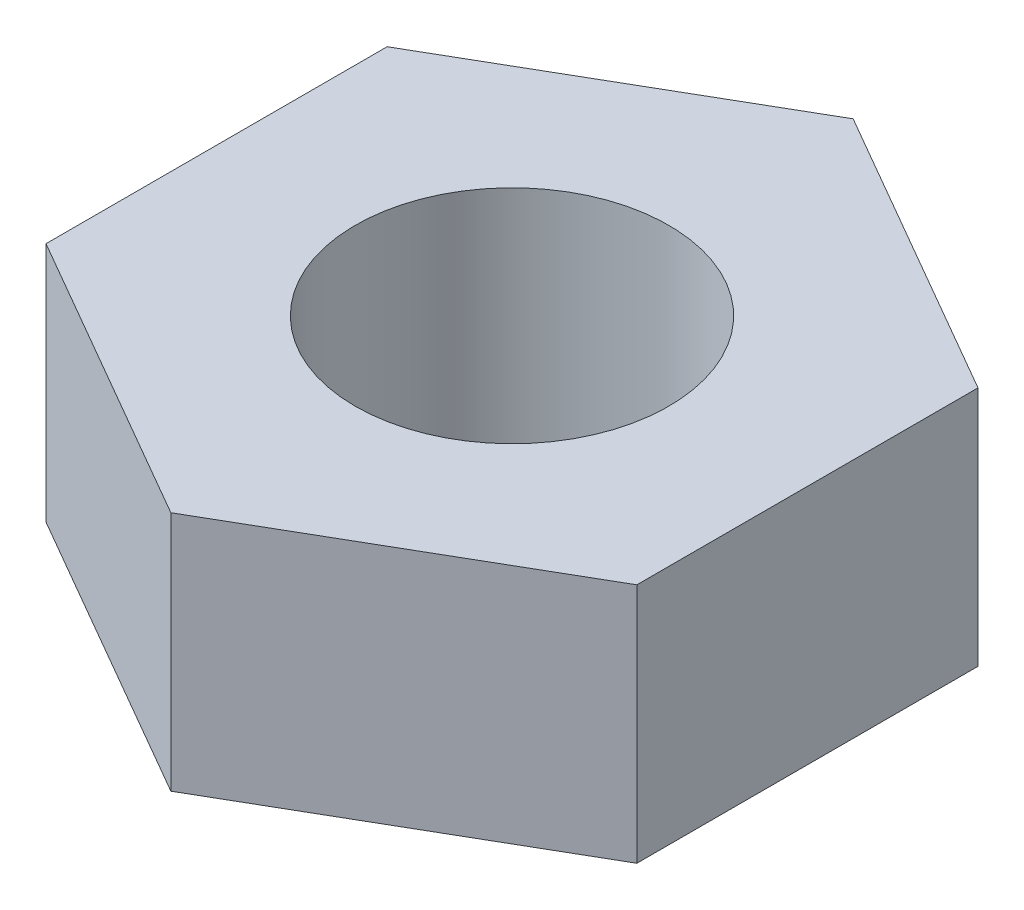
ISO-10303-21;
HEADER;
FILE_DESCRIPTION(('STEP AP214'),'2;1');
FILE_NAME('part.step','',(''),(''),'','','');
FILE_SCHEMA(('AUTOMOTIVE_DESIGN { 1 0 10303 214 1 1 1 1 }'));
ENDSEC;
DATA;
#1=APPLICATION_CONTEXT('core data for automotive mechanical design processes');
#2=APPLICATION_PROTOCOL_DEFINITION('international standard','automotive_design',2000,#1);
#3=PRODUCT_CONTEXT('',#1,'mechanical');
#4=PRODUCT('Part','Part','',(#3));
#5=PRODUCT_RELATED_PRODUCT_CATEGORY('part','',(#4));
#6=PRODUCT_DEFINITION_FORMATION('','',#4);
#7=PRODUCT_DEFINITION_CONTEXT('part definition',#1,'design');
#8=PRODUCT_DEFINITION('design','',#6,#7);
#9=PRODUCT_DEFINITION_SHAPE('','',#8);
#10=(LENGTH_UNIT() NAMED_UNIT(*) SI_UNIT(.MILLI.,.METRE.));
#11=(NAMED_UNIT(*) PLANE_ANGLE_UNIT() SI_UNIT($,.RADIAN.));
#12=(NAMED_UNIT(*) SI_UNIT($,.STERADIAN.) SOLID_ANGLE_UNIT());
#13=UNCERTAINTY_MEASURE_WITH_UNIT(LENGTH_MEASURE(1.E-05),#10,'distance_accuracy_value','');
#14=(GEOMETRIC_REPRESENTATION_CONTEXT(3) GLOBAL_UNCERTAINTY_ASSIGNED_CONTEXT((#13)) GLOBAL_UNIT_ASSIGNED_CONTEXT((#10,
#11,#12)) REPRESENTATION_CONTEXT('',''));
#15=CARTESIAN_POINT('',(0.,0.,0.));
#16=DIRECTION('',(0.,0.,1.));
#17=DIRECTION('',(1.,0.,0.));
#18=AXIS2_PLACEMENT_3D('',#15,#16,#17);
#19=CARTESIAN_POINT('',(-1.274,17.,-20.32227878526));
#20=DIRECTION('',(0.,1.,0.));
#21=DIRECTION('',(0.866025403784464,0.,-0.499999999999956));
#22=AXIS2_PLACEMENT_3D('',#19,#20,#21);
#23=PLANE('',#22);
#24=CARTESIAN_POINT('',(0.,17.,-24.));
#25=DIRECTION('',(0.,1.,0.));
#26=DIRECTION('',(0.,0.,1.));
#27=AXIS2_PLACEMENT_3D('',#24,#25,#26);
#28=CIRCLE('',#27,1.3000000000002);
#29=CARTESIAN_POINT('',(0.,17.,-22.6999999999998));
#30=VERTEX_POINT('',#29);
#31=EDGE_CURVE('E21',#30,#30,#28,.F.);
#32=ORIENTED_EDGE('',*,*,#31,.T.);
#33=EDGE_LOOP('',(#32));
#34=FACE_BOUND('',#33,.T.);
#35=DIRECTION('',(0.866025403783726,0.,0.500000000001234));
#36=VECTOR('',#35,1.);
#37=CARTESIAN_POINT('',(1.225,17.,-26.12176223927));
#38=LINE('',#37,#36);
#39=CARTESIAN_POINT('',(2.44999999987504,17.,-25.4145081595822));
#40=VERTEX_POINT('',#39);
#41=CARTESIAN_POINT('',(0.,17.,-26.8290163190298));
#42=VERTEX_POINT('',#41);
#43=EDGE_CURVE('E104',#40,#42,#38,.F.);
#44=ORIENTED_EDGE('',*,*,#43,.T.);
#45=DIRECTION('',(0.866025403783726,0.,-0.500000000001234));
#46=VECTOR('',#45,1.);
#47=CARTESIAN_POINT('',(-1.225,17.,-26.12176223927));
#48=LINE('',#47,#46);
#49=CARTESIAN_POINT('',(-2.45000000000008,17.,-25.4145081595101));
#50=VERTEX_POINT('',#49);
#51=EDGE_CURVE('E83',#42,#50,#48,.F.);
#52=ORIENTED_EDGE('',*,*,#51,.T.);
#53=DIRECTION('',(0.,0.,-1.));
#54=VECTOR('',#53,1.);
#55=CARTESIAN_POINT('',(-2.45,17.,-24.));
#56=LINE('',#55,#54);
#57=CARTESIAN_POINT('',(-2.45000000000004,17.,-22.5854918406343));
#58=VERTEX_POINT('',#57);
#59=EDGE_CURVE('E80',#50,#58,#56,.F.);
#60=ORIENTED_EDGE('',*,*,#59,.T.);
#61=DIRECTION('',(-0.866025403783727,0.,-0.500000000001233));
#62=VECTOR('',#61,1.);
#63=CARTESIAN_POINT('',(-1.225,17.,-21.87823776073));
#64=LINE('',#63,#62);
#65=CARTESIAN_POINT('',(0.,17.,-21.1709836809701));
#66=VERTEX_POINT('',#65);
#67=EDGE_CURVE('E81',#58,#66,#64,.F.);
#68=ORIENTED_EDGE('',*,*,#67,.T.);
#69=DIRECTION('',(-0.866025403783727,0.,0.500000000001233));
#70=VECTOR('',#69,1.);
#71=CARTESIAN_POINT('',(1.225,17.,-21.87823776073));
#72=LINE('',#71,#70);
#73=CARTESIAN_POINT('',(2.45000000000008,17.,-22.5854918404899));
#74=VERTEX_POINT('',#73);
#75=EDGE_CURVE('E110',#66,#74,#72,.F.);
#76=ORIENTED_EDGE('',*,*,#75,.T.);
#77=DIRECTION('',(0.,0.,1.));
#78=VECTOR('',#77,1.);
#79=CARTESIAN_POINT('',(2.45,17.,-24.));
#80=LINE('',#79,#78);
#81=EDGE_CURVE('E105',#74,#40,#80,.F.);
#82=ORIENTED_EDGE('',*,*,#81,.T.);
#83=EDGE_LOOP('',(#44,#52,#60,#68,#76,#82));
#84=FACE_BOUND('',#83,.T.);
#85=ADVANCED_FACE('F17',(#34,#84),#23,.T.);
#86=CARTESIAN_POINT('',(-0.049,14.96,-21.14269351778));
#87=DIRECTION('',(0.500000000001233,0.,0.866025403783727));
#88=DIRECTION('',(0.866025403783727,0.,-0.500000000001233));
#89=AXIS2_PLACEMENT_3D('',#86,#87,#88);
#90=PLANE('',#89);
#91=ORIENTED_EDGE('',*,*,#75,.F.);
#92=DIRECTION('',(0.,1.,0.));
#93=VECTOR('',#92,1.);
#94=CARTESIAN_POINT('',(1.63687422990999E-13,16.,-21.1709836809703));
#95=LINE('',#94,#93);
#96=CARTESIAN_POINT('',(2.4583606634751E-13,15.,-21.1709836809702));
#97=VERTEX_POINT('',#96);
#98=EDGE_CURVE('E90',#66,#97,#95,.F.);
#99=ORIENTED_EDGE('',*,*,#98,.T.);
#100=DIRECTION('',(0.866025403784464,0.,-0.499999999999956));
#101=VECTOR('',#100,1.);
#102=CARTESIAN_POINT('',(1.22499999999946,15.,-21.8782377607269));
#103=LINE('',#102,#101);
#104=CARTESIAN_POINT('',(2.45,15.,-22.5854918404872));
#105=VERTEX_POINT('',#104);
#106=EDGE_CURVE('E58',#97,#105,#103,.T.);
#107=ORIENTED_EDGE('',*,*,#106,.T.);
#108=DIRECTION('',(0.,-1.,0.));
#109=VECTOR('',#108,1.);
#110=CARTESIAN_POINT('',(2.45,16.,-22.58549184049));
#111=LINE('',#110,#109);
#112=EDGE_CURVE('E51',#105,#74,#111,.F.);
#113=ORIENTED_EDGE('',*,*,#112,.T.);
#114=EDGE_LOOP('',(#91,#99,#107,#113));
#115=FACE_BOUND('',#114,.T.);
#116=ADVANCED_FACE('F122',(#115),#90,.T.);
#117=CARTESIAN_POINT('',(2.45,14.96,-22.5289115141));
#118=DIRECTION('',(1.,0.,0.));
#119=DIRECTION('',(0.,0.,-1.));
#120=AXIS2_PLACEMENT_3D('',#117,#118,#119);
#121=PLANE('',#120);
#122=ORIENTED_EDGE('',*,*,#81,.F.);
#123=ORIENTED_EDGE('',*,*,#112,.F.);
#124=DIRECTION('',(0.,0.,-1.));
#125=VECTOR('',#124,1.);
#126=CARTESIAN_POINT('',(2.45,15.,-22.5289115141));
#127=LINE('',#126,#125);
#128=CARTESIAN_POINT('',(2.45000000000008,15.,-25.4145081595103));
#129=VERTEX_POINT('',#128);
#130=EDGE_CURVE('E112',#105,#129,#127,.T.);
#131=ORIENTED_EDGE('',*,*,#130,.T.);
#132=DIRECTION('',(0.,-1.,0.));
#133=VECTOR('',#132,1.);
#134=CARTESIAN_POINT('',(2.45000000000017,16.,-25.4145081595103));
#135=LINE('',#134,#133);
#136=EDGE_CURVE('E101',#129,#40,#135,.F.);
#137=ORIENTED_EDGE('',*,*,#136,.T.);
#138=EDGE_LOOP('',(#122,#123,#131,#137));
#139=FACE_BOUND('',#138,.T.);
#140=ADVANCED_FACE('F118',(#139),#121,.T.);
#141=CARTESIAN_POINT('',(2.499,14.96,-25.38621799632));
#142=DIRECTION('',(0.500000000001234,0.,-0.866025403783726));
#143=DIRECTION('',(-0.866025403783726,0.,-0.500000000001234));
#144=AXIS2_PLACEMENT_3D('',#141,#142,#143);
#145=PLANE('',#144);
#146=ORIENTED_EDGE('',*,*,#43,.F.);
#147=ORIENTED_EDGE('',*,*,#136,.F.);
#148=DIRECTION('',(-0.866025403783726,0.,-0.500000000001234));
#149=VECTOR('',#148,1.);
#150=CARTESIAN_POINT('',(2.499,15.,-25.38621799632));
#151=LINE('',#150,#149);
#152=CARTESIAN_POINT('',(-1.01959049926895E-13,15.,-26.8290163190297));
#153=VERTEX_POINT('',#152);
#154=EDGE_CURVE('E116',#129,#153,#151,.T.);
#155=ORIENTED_EDGE('',*,*,#154,.T.);
#156=DIRECTION('',(0.,-1.,0.));
#157=VECTOR('',#156,1.);
#158=CARTESIAN_POINT('',(1.6071941954382E-13,16.,-26.8290163190297));
#159=LINE('',#158,#157);
#160=EDGE_CURVE('E106',#153,#42,#159,.F.);
#161=ORIENTED_EDGE('',*,*,#160,.T.);
#162=EDGE_LOOP('',(#146,#147,#155,#161));
#163=FACE_BOUND('',#162,.T.);
#164=ADVANCED_FACE('F128',(#163),#145,.T.);
#165=CARTESIAN_POINT('',(0.049,14.96,-26.85730648222));
#166=DIRECTION('',(-0.500000000001234,0.,-0.866025403783726));
#167=DIRECTION('',(-0.866025403783726,0.,0.500000000001234));
#168=AXIS2_PLACEMENT_3D('',#165,#166,#167);
#169=PLANE('',#168);
#170=ORIENTED_EDGE('',*,*,#51,.F.);
#171=ORIENTED_EDGE('',*,*,#160,.F.);
#172=DIRECTION('',(-0.866025403784463,0.,0.499999999999958));
#173=VECTOR('',#172,1.);
#174=CARTESIAN_POINT('',(-1.22499999999946,15.,-26.1217622392731));
#175=LINE('',#174,#173);
#176=CARTESIAN_POINT('',(-2.45,15.,-25.4145081595128));
#177=VERTEX_POINT('',#176);
#178=EDGE_CURVE('E99',#153,#177,#175,.T.);
#179=ORIENTED_EDGE('',*,*,#178,.T.);
#180=DIRECTION('',(0.,-1.,0.));
#181=VECTOR('',#180,1.);
#182=CARTESIAN_POINT('',(-2.45,16.,-25.41450815951));
#183=LINE('',#182,#181);
#184=EDGE_CURVE('E86',#177,#50,#183,.F.);
#185=ORIENTED_EDGE('',*,*,#184,.T.);
#186=EDGE_LOOP('',(#170,#171,#179,#185));
#187=FACE_BOUND('',#186,.T.);
#188=ADVANCED_FACE('F125',(#187),#169,.T.);
#189=CARTESIAN_POINT('',(-2.45,14.96,-25.4710884859));
#190=DIRECTION('',(-1.,0.,0.));
#191=DIRECTION('',(0.,0.,1.));
#192=AXIS2_PLACEMENT_3D('',#189,#190,#191);
#193=PLANE('',#192);
#194=ORIENTED_EDGE('',*,*,#59,.F.);
#195=ORIENTED_EDGE('',*,*,#184,.F.);
#196=DIRECTION('',(0.,0.,1.));
#197=VECTOR('',#196,1.);
#198=CARTESIAN_POINT('',(-2.45,15.,-25.4710884859));
#199=LINE('',#198,#197);
#200=CARTESIAN_POINT('',(-2.45000000000008,15.,-22.5854918404897));
#201=VERTEX_POINT('',#200);
#202=EDGE_CURVE('E95',#177,#201,#199,.T.);
#203=ORIENTED_EDGE('',*,*,#202,.T.);
#204=DIRECTION('',(0.,-1.,0.));
#205=VECTOR('',#204,1.);
#206=CARTESIAN_POINT('',(-2.45000000000016,16.,-22.5854918404897));
#207=LINE('',#206,#205);
#208=EDGE_CURVE('E36',#201,#58,#207,.F.);
#209=ORIENTED_EDGE('',*,*,#208,.T.);
#210=EDGE_LOOP('',(#194,#195,#203,#209));
#211=FACE_BOUND('',#210,.T.);
#212=ADVANCED_FACE('F93',(#211),#193,.T.);
#213=CARTESIAN_POINT('',(-2.499,14.96,-22.61378200368));
#214=DIRECTION('',(-0.500000000001233,0.,0.866025403783727));
#215=DIRECTION('',(0.866025403783727,0.,0.500000000001233));
#216=AXIS2_PLACEMENT_3D('',#213,#214,#215);
#217=PLANE('',#216);
#218=ORIENTED_EDGE('',*,*,#67,.F.);
#219=ORIENTED_EDGE('',*,*,#208,.F.);
#220=DIRECTION('',(0.866025403783727,0.,0.500000000001233));
#221=VECTOR('',#220,1.);
#222=CARTESIAN_POINT('',(-2.499,15.,-22.61378200368));
#223=LINE('',#222,#221);
#224=EDGE_CURVE('E27',#201,#97,#223,.T.);
#225=ORIENTED_EDGE('',*,*,#224,.T.);
#226=ORIENTED_EDGE('',*,*,#98,.F.);
#227=EDGE_LOOP('',(#218,#219,#225,#226));
#228=FACE_BOUND('',#227,.T.);
#229=ADVANCED_FACE('F89',(#228),#217,.T.);
#230=CARTESIAN_POINT('',(0.,15.,-24.));
#231=DIRECTION('',(0.,1.,0.));
#232=DIRECTION('',(0.,0.,1.));
#233=AXIS2_PLACEMENT_3D('',#230,#231,#232);
#234=CYLINDRICAL_SURFACE('',#233,1.3000000000002);
#235=ORIENTED_EDGE('',*,*,#31,.F.);
#236=EDGE_LOOP('',(#235));
#237=FACE_BOUND('',#236,.T.);
#238=CARTESIAN_POINT('',(0.,15.,-24.));
#239=DIRECTION('',(0.,1.,0.));
#240=DIRECTION('',(0.,0.,1.));
#241=AXIS2_PLACEMENT_3D('',#238,#239,#240);
#242=CIRCLE('',#241,1.3000000000002);
#243=CARTESIAN_POINT('',(0.,15.,-22.6999999999998));
#244=VERTEX_POINT('',#243);
#245=EDGE_CURVE('E11',#244,#244,#242,.F.);
#246=ORIENTED_EDGE('',*,*,#245,.T.);
#247=EDGE_LOOP('',(#246));
#248=FACE_BOUND('',#247,.T.);
#249=ADVANCED_FACE('F143',(#237,#248),#234,.F.);
#250=CARTESIAN_POINT('',(-1.274,15.,-20.32227878526));
#251=DIRECTION('',(0.,1.,0.));
#252=DIRECTION('',(0.866025403784464,0.,-0.499999999999956));
#253=AXIS2_PLACEMENT_3D('',#250,#251,#252);
#254=PLANE('',#253);
#255=ORIENTED_EDGE('',*,*,#245,.F.);
#256=EDGE_LOOP('',(#255));
#257=FACE_BOUND('',#256,.T.);
#258=ORIENTED_EDGE('',*,*,#202,.F.);
#259=ORIENTED_EDGE('',*,*,#178,.F.);
#260=ORIENTED_EDGE('',*,*,#154,.F.);
#261=ORIENTED_EDGE('',*,*,#130,.F.);
#262=ORIENTED_EDGE('',*,*,#106,.F.);
#263=ORIENTED_EDGE('',*,*,#224,.F.);
#264=EDGE_LOOP('',(#258,#259,#260,#261,#262,#263));
#265=FACE_BOUND('',#264,.T.);
#266=ADVANCED_FACE('F19',(#257,#265),#254,.F.);
#267=CLOSED_SHELL('',(#85,#116,#140,#164,#188,#212,#229,#249,#266));
#268=MANIFOLD_SOLID_BREP('B1',#267);
#269=ADVANCED_BREP_SHAPE_REPRESENTATION('',(#18,#268),#14);
#270=SHAPE_DEFINITION_REPRESENTATION(#9,#269);
ENDSEC;
END-ISO-10303-21;
